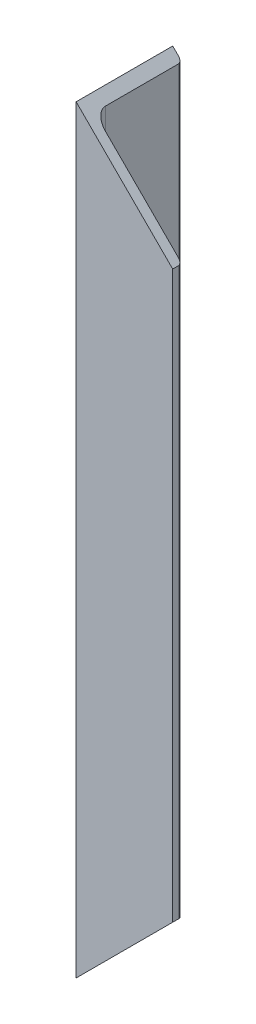
ISO-10303-21;
HEADER;
FILE_DESCRIPTION(('STEP AP214'),'2;1');
FILE_NAME('part.step','',(''),(''),'','','');
FILE_SCHEMA(('AUTOMOTIVE_DESIGN { 1 0 10303 214 1 1 1 1 }'));
ENDSEC;
DATA;
#1=APPLICATION_CONTEXT('core data for automotive mechanical design processes');
#2=APPLICATION_PROTOCOL_DEFINITION('international standard','automotive_design',2000,#1);
#3=PRODUCT_CONTEXT('',#1,'mechanical');
#4=PRODUCT('Part','Part','',(#3));
#5=PRODUCT_RELATED_PRODUCT_CATEGORY('part','',(#4));
#6=PRODUCT_DEFINITION_FORMATION('','',#4);
#7=PRODUCT_DEFINITION_CONTEXT('part definition',#1,'design');
#8=PRODUCT_DEFINITION('design','',#6,#7);
#9=PRODUCT_DEFINITION_SHAPE('','',#8);
#10=(LENGTH_UNIT() NAMED_UNIT(*) SI_UNIT(.MILLI.,.METRE.));
#11=(NAMED_UNIT(*) PLANE_ANGLE_UNIT() SI_UNIT($,.RADIAN.));
#12=(NAMED_UNIT(*) SI_UNIT($,.STERADIAN.) SOLID_ANGLE_UNIT());
#13=UNCERTAINTY_MEASURE_WITH_UNIT(LENGTH_MEASURE(1.E-05),#10,'distance_accuracy_value','');
#14=(GEOMETRIC_REPRESENTATION_CONTEXT(3) GLOBAL_UNCERTAINTY_ASSIGNED_CONTEXT((#13)) GLOBAL_UNIT_ASSIGNED_CONTEXT((#10,
#11,#12)) REPRESENTATION_CONTEXT('',''));
#15=CARTESIAN_POINT('',(0.,0.,0.));
#16=DIRECTION('',(0.,0.,1.));
#17=DIRECTION('',(1.,0.,0.));
#18=AXIS2_PLACEMENT_3D('',#15,#16,#17);
#19=CARTESIAN_POINT('',(-664.237613309007,1082.237613309,482.237613309005));
#20=DIRECTION('',(0.707106781186548,0.707106781186547,0.));
#21=DIRECTION('',(-0.707106781186547,0.707106781186548,0.));
#22=AXIS2_PLACEMENT_3D('',#19,#20,#21);
#23=PLANE('',#22);
#24=DIRECTION('',(0.707106781186547,-0.707106781186548,0.));
#25=VECTOR('',#24,1.);
#26=CARTESIAN_POINT('',(-403.000000000003,821.,500.000000000003));
#27=LINE('',#26,#25);
#28=CARTESIAN_POINT('',(-682.000000000003,1100.,500.));
#29=VERTEX_POINT('',#28);
#30=CARTESIAN_POINT('',(-619.000000000003,1037.,500.000000000001));
#31=VERTEX_POINT('',#30);
#32=EDGE_CURVE('E126',#29,#31,#27,.T.);
#33=ORIENTED_EDGE('',*,*,#32,.T.);
#34=DIRECTION('',(0.,0.,-1.));
#35=VECTOR('',#34,1.);
#36=CARTESIAN_POINT('',(-619.000000000003,1037.,499.999999999988));
#37=LINE('',#36,#35);
#38=CARTESIAN_POINT('',(-619.000000000003,1037.,496.300000000001));
#39=VERTEX_POINT('',#38);
#40=EDGE_CURVE('E109',#31,#39,#37,.T.);
#41=ORIENTED_EDGE('',*,*,#40,.T.);
#42=CARTESIAN_POINT('',(-621.300000000003,1039.3,496.300000000001));
#43=DIRECTION('',(0.707106781186548,0.707106781186547,0.));
#44=DIRECTION('',(-0.707106781186547,0.707106781186548,0.));
#45=AXIS2_PLACEMENT_3D('',#42,#43,#44);
#46=ELLIPSE('',#45,3.25269119345812,2.3);
#47=CARTESIAN_POINT('',(-621.300000000003,1039.3,494.000000000001));
#48=VERTEX_POINT('',#47);
#49=EDGE_CURVE('E115',#39,#48,#46,.T.);
#50=ORIENTED_EDGE('',*,*,#49,.T.);
#51=DIRECTION('',(-0.707106781186547,0.707106781186548,0.));
#52=VECTOR('',#51,1.);
#53=CARTESIAN_POINT('',(-404.150000000003,822.15,494.000000000003));
#54=LINE('',#53,#52);
#55=CARTESIAN_POINT('',(-669.000000000003,1087.,494.));
#56=VERTEX_POINT('',#55);
#57=EDGE_CURVE('E122',#48,#56,#54,.T.);
#58=ORIENTED_EDGE('',*,*,#57,.T.);
#59=CARTESIAN_POINT('',(-669.000000000003,1087.,487.));
#60=DIRECTION('',(0.707106781186548,0.707106781186547,0.));
#61=DIRECTION('',(-0.707106781186547,0.707106781186548,0.));
#62=AXIS2_PLACEMENT_3D('',#59,#60,#61);
#63=ELLIPSE('',#62,9.89949493661168,7.00000000000001);
#64=CARTESIAN_POINT('',(-676.000000000003,1094.,487.));
#65=VERTEX_POINT('',#64);
#66=EDGE_CURVE('E142',#56,#65,#63,.F.);
#67=ORIENTED_EDGE('',*,*,#66,.T.);
#68=DIRECTION('',(0.,0.,-1.));
#69=VECTOR('',#68,1.);
#70=CARTESIAN_POINT('',(-676.000000000003,1094.,486.999999999994));
#71=LINE('',#70,#69);
#72=CARTESIAN_POINT('',(-676.000000000003,1094.,439.3));
#73=VERTEX_POINT('',#72);
#74=EDGE_CURVE('E139',#65,#73,#71,.T.);
#75=ORIENTED_EDGE('',*,*,#74,.T.);
#76=CARTESIAN_POINT('',(-678.300000000003,1096.3,439.3));
#77=DIRECTION('',(0.707106781186548,0.707106781186547,0.));
#78=DIRECTION('',(-0.707106781186547,0.707106781186548,0.));
#79=AXIS2_PLACEMENT_3D('',#76,#77,#78);
#80=ELLIPSE('',#79,3.25269119345816,2.30000000000002);
#81=CARTESIAN_POINT('',(-678.300000000003,1096.3,437.));
#82=VERTEX_POINT('',#81);
#83=EDGE_CURVE('E136',#73,#82,#80,.T.);
#84=ORIENTED_EDGE('',*,*,#83,.T.);
#85=DIRECTION('',(-0.707106781186547,0.707106781186548,0.));
#86=VECTOR('',#85,1.);
#87=CARTESIAN_POINT('',(-432.650000000003,850.649999999999,437.000000000004));
#88=LINE('',#87,#86);
#89=CARTESIAN_POINT('',(-682.000000000003,1100.,437.));
#90=VERTEX_POINT('',#89);
#91=EDGE_CURVE('E133',#82,#90,#88,.T.);
#92=ORIENTED_EDGE('',*,*,#91,.T.);
#93=DIRECTION('',(0.,0.,1.));
#94=VECTOR('',#93,1.);
#95=CARTESIAN_POINT('',(-682.000000000003,1100.,499.999999999995));
#96=LINE('',#95,#94);
#97=EDGE_CURVE('E131',#90,#29,#96,.T.);
#98=ORIENTED_EDGE('',*,*,#97,.T.);
#99=EDGE_LOOP('',(#33,#41,#50,#58,#67,#75,#84,#92,#98));
#100=FACE_BOUND('',#99,.T.);
#101=ADVANCED_FACE('F34',(#100),#23,.T.);
#102=CARTESIAN_POINT('',(-621.300000000003,605.,496.300000000001));
#103=DIRECTION('',(0.,1.,0.));
#104=DIRECTION('',(-1.,0.,0.));
#105=AXIS2_PLACEMENT_3D('',#102,#103,#104);
#106=CYLINDRICAL_SURFACE('',#105,2.3);
#107=DIRECTION('',(0.,1.,0.));
#108=VECTOR('',#107,1.);
#109=CARTESIAN_POINT('',(-619.000000000003,605.,496.300000000001));
#110=LINE('',#109,#108);
#111=CARTESIAN_POINT('',(-619.000000000003,668.,496.300000000001));
#112=VERTEX_POINT('',#111);
#113=EDGE_CURVE('E104',#112,#39,#110,.T.);
#114=ORIENTED_EDGE('',*,*,#113,.F.);
#115=CARTESIAN_POINT('',(-621.300000000003,665.7,496.300000000001));
#116=DIRECTION('',(-0.707106781186548,0.707106781186547,0.));
#117=DIRECTION('',(0.707106781186547,0.707106781186548,0.));
#118=AXIS2_PLACEMENT_3D('',#115,#116,#117);
#119=ELLIPSE('',#118,3.25269119345811,2.3);
#120=CARTESIAN_POINT('',(-621.300000000003,665.7,494.000000000001));
#121=VERTEX_POINT('',#120);
#122=EDGE_CURVE('E37',#112,#121,#119,.T.);
#123=ORIENTED_EDGE('',*,*,#122,.T.);
#124=DIRECTION('',(0.,1.,0.));
#125=VECTOR('',#124,1.);
#126=CARTESIAN_POINT('',(-621.300000000003,605.,494.000000000001));
#127=LINE('',#126,#125);
#128=EDGE_CURVE('E118',#121,#48,#127,.T.);
#129=ORIENTED_EDGE('',*,*,#128,.T.);
#130=ORIENTED_EDGE('',*,*,#49,.F.);
#131=EDGE_LOOP('',(#114,#123,#129,#130));
#132=FACE_BOUND('',#131,.T.);
#133=ADVANCED_FACE('F116',(#132),#106,.T.);
#134=CARTESIAN_POINT('',(-621.300000000003,605.,494.000000000001));
#135=DIRECTION('',(0.,0.,1.));
#136=DIRECTION('',(1.,0.,0.));
#137=AXIS2_PLACEMENT_3D('',#134,#135,#136);
#138=PLANE('',#137);
#139=ORIENTED_EDGE('',*,*,#128,.F.);
#140=DIRECTION('',(-0.707106781186547,-0.707106781186548,0.));
#141=VECTOR('',#140,1.);
#142=CARTESIAN_POINT('',(-651.650000000003,635.35,494.));
#143=LINE('',#142,#141);
#144=CARTESIAN_POINT('',(-669.000000000004,617.999999999999,494.));
#145=VERTEX_POINT('',#144);
#146=EDGE_CURVE('E175',#121,#145,#143,.T.);
#147=ORIENTED_EDGE('',*,*,#146,.T.);
#148=DIRECTION('',(0.,1.,0.));
#149=VECTOR('',#148,1.);
#150=CARTESIAN_POINT('',(-669.000000000003,605.,494.));
#151=LINE('',#150,#149);
#152=EDGE_CURVE('E147',#145,#56,#151,.T.);
#153=ORIENTED_EDGE('',*,*,#152,.T.);
#154=ORIENTED_EDGE('',*,*,#57,.F.);
#155=EDGE_LOOP('',(#139,#147,#153,#154));
#156=FACE_BOUND('',#155,.T.);
#157=ADVANCED_FACE('F180',(#156),#138,.F.);
#158=CARTESIAN_POINT('',(-669.000000000003,605.,487.));
#159=DIRECTION('',(0.,1.,0.));
#160=DIRECTION('',(-1.,0.,0.));
#161=AXIS2_PLACEMENT_3D('',#158,#159,#160);
#162=CYLINDRICAL_SURFACE('',#161,7.00000000000001);
#163=ORIENTED_EDGE('',*,*,#152,.F.);
#164=CARTESIAN_POINT('',(-669.000000000003,618.,487.));
#165=DIRECTION('',(-0.707106781186548,0.707106781186547,0.));
#166=DIRECTION('',(0.707106781186547,0.707106781186548,0.));
#167=AXIS2_PLACEMENT_3D('',#164,#165,#166);
#168=ELLIPSE('',#167,9.89949493661167,7.00000000000001);
#169=CARTESIAN_POINT('',(-676.000000000003,611.,487.));
#170=VERTEX_POINT('',#169);
#171=EDGE_CURVE('E172',#145,#170,#168,.F.);
#172=ORIENTED_EDGE('',*,*,#171,.T.);
#173=DIRECTION('',(0.,1.,0.));
#174=VECTOR('',#173,1.);
#175=CARTESIAN_POINT('',(-676.000000000003,605.,487.));
#176=LINE('',#175,#174);
#177=EDGE_CURVE('E149',#170,#65,#176,.T.);
#178=ORIENTED_EDGE('',*,*,#177,.T.);
#179=ORIENTED_EDGE('',*,*,#66,.F.);
#180=EDGE_LOOP('',(#163,#172,#178,#179));
#181=FACE_BOUND('',#180,.T.);
#182=ADVANCED_FACE('F184',(#181),#162,.F.);
#183=CARTESIAN_POINT('',(-676.000000000003,605.,487.));
#184=DIRECTION('',(-1.,0.,0.));
#185=DIRECTION('',(0.,0.,1.));
#186=AXIS2_PLACEMENT_3D('',#183,#184,#185);
#187=PLANE('',#186);
#188=ORIENTED_EDGE('',*,*,#177,.F.);
#189=DIRECTION('',(0.,0.,-1.));
#190=VECTOR('',#189,1.);
#191=CARTESIAN_POINT('',(-676.000000000003,611.,487.));
#192=LINE('',#191,#190);
#193=CARTESIAN_POINT('',(-676.000000000003,611.000000000001,439.3));
#194=VERTEX_POINT('',#193);
#195=EDGE_CURVE('E169',#170,#194,#192,.T.);
#196=ORIENTED_EDGE('',*,*,#195,.T.);
#197=DIRECTION('',(0.,1.,0.));
#198=VECTOR('',#197,1.);
#199=CARTESIAN_POINT('',(-676.000000000003,605.,439.3));
#200=LINE('',#199,#198);
#201=EDGE_CURVE('E151',#194,#73,#200,.T.);
#202=ORIENTED_EDGE('',*,*,#201,.T.);
#203=ORIENTED_EDGE('',*,*,#74,.F.);
#204=EDGE_LOOP('',(#188,#196,#202,#203));
#205=FACE_BOUND('',#204,.T.);
#206=ADVANCED_FACE('F187',(#205),#187,.F.);
#207=CARTESIAN_POINT('',(-678.300000000003,605.,439.3));
#208=DIRECTION('',(0.,1.,0.));
#209=DIRECTION('',(-1.,0.,0.));
#210=AXIS2_PLACEMENT_3D('',#207,#208,#209);
#211=CYLINDRICAL_SURFACE('',#210,2.30000000000002);
#212=ORIENTED_EDGE('',*,*,#201,.F.);
#213=CARTESIAN_POINT('',(-678.300000000003,608.700000000001,439.3));
#214=DIRECTION('',(-0.707106781186548,0.707106781186547,0.));
#215=DIRECTION('',(0.707106781186547,0.707106781186548,0.));
#216=AXIS2_PLACEMENT_3D('',#213,#214,#215);
#217=ELLIPSE('',#216,3.25269119345815,2.30000000000002);
#218=CARTESIAN_POINT('',(-678.300000000002,608.700000000001,437.));
#219=VERTEX_POINT('',#218);
#220=EDGE_CURVE('E166',#194,#219,#217,.T.);
#221=ORIENTED_EDGE('',*,*,#220,.T.);
#222=DIRECTION('',(0.,1.,0.));
#223=VECTOR('',#222,1.);
#224=CARTESIAN_POINT('',(-678.300000000002,605.,437.));
#225=LINE('',#224,#223);
#226=EDGE_CURVE('E153',#219,#82,#225,.T.);
#227=ORIENTED_EDGE('',*,*,#226,.T.);
#228=ORIENTED_EDGE('',*,*,#83,.F.);
#229=EDGE_LOOP('',(#212,#221,#227,#228));
#230=FACE_BOUND('',#229,.T.);
#231=ADVANCED_FACE('F191',(#230),#211,.T.);
#232=CARTESIAN_POINT('',(-678.300000000002,605.,437.));
#233=DIRECTION('',(0.,0.,1.));
#234=DIRECTION('',(1.,0.,0.));
#235=AXIS2_PLACEMENT_3D('',#232,#233,#234);
#236=PLANE('',#235);
#237=ORIENTED_EDGE('',*,*,#226,.F.);
#238=DIRECTION('',(-0.707106781186547,-0.707106781186548,0.));
#239=VECTOR('',#238,1.);
#240=CARTESIAN_POINT('',(-680.150000000003,606.85,437.));
#241=LINE('',#240,#239);
#242=CARTESIAN_POINT('',(-682.000000000003,605.,437.));
#243=VERTEX_POINT('',#242);
#244=EDGE_CURVE('E161',#219,#243,#241,.T.);
#245=ORIENTED_EDGE('',*,*,#244,.T.);
#246=DIRECTION('',(0.,1.,0.));
#247=VECTOR('',#246,1.);
#248=CARTESIAN_POINT('',(-682.000000000003,605.,437.));
#249=LINE('',#248,#247);
#250=EDGE_CURVE('E155',#243,#90,#249,.T.);
#251=ORIENTED_EDGE('',*,*,#250,.T.);
#252=ORIENTED_EDGE('',*,*,#91,.F.);
#253=EDGE_LOOP('',(#237,#245,#251,#252));
#254=FACE_BOUND('',#253,.T.);
#255=ADVANCED_FACE('F196',(#254),#236,.F.);
#256=CARTESIAN_POINT('',(-682.000000000003,605.,500.));
#257=DIRECTION('',(1.,0.,0.));
#258=DIRECTION('',(0.,0.,-1.));
#259=AXIS2_PLACEMENT_3D('',#256,#257,#258);
#260=PLANE('',#259);
#261=ORIENTED_EDGE('',*,*,#250,.F.);
#262=DIRECTION('',(0.,0.,1.));
#263=VECTOR('',#262,1.);
#264=CARTESIAN_POINT('',(-682.000000000003,605.,500.));
#265=LINE('',#264,#263);
#266=CARTESIAN_POINT('',(-682.000000000003,605.,500.));
#267=VERTEX_POINT('',#266);
#268=EDGE_CURVE('E54',#243,#267,#265,.T.);
#269=ORIENTED_EDGE('',*,*,#268,.T.);
#270=DIRECTION('',(0.,1.,0.));
#271=VECTOR('',#270,1.);
#272=CARTESIAN_POINT('',(-682.000000000003,605.,500.));
#273=LINE('',#272,#271);
#274=EDGE_CURVE('E157',#267,#29,#273,.T.);
#275=ORIENTED_EDGE('',*,*,#274,.T.);
#276=ORIENTED_EDGE('',*,*,#97,.F.);
#277=EDGE_LOOP('',(#261,#269,#275,#276));
#278=FACE_BOUND('',#277,.T.);
#279=ADVANCED_FACE('F198',(#278),#260,.F.);
#280=CARTESIAN_POINT('',(-619.000000000003,605.,500.000000000001));
#281=DIRECTION('',(0.,0.,-1.));
#282=DIRECTION('',(-1.,0.,0.));
#283=AXIS2_PLACEMENT_3D('',#280,#281,#282);
#284=PLANE('',#283);
#285=ORIENTED_EDGE('',*,*,#274,.F.);
#286=DIRECTION('',(0.707106781186547,0.707106781186548,0.));
#287=VECTOR('',#286,1.);
#288=CARTESIAN_POINT('',(-650.500000000003,636.5,500.));
#289=LINE('',#288,#287);
#290=CARTESIAN_POINT('',(-619.000000000003,668.,500.000000000001));
#291=VERTEX_POINT('',#290);
#292=EDGE_CURVE('E42',#267,#291,#289,.T.);
#293=ORIENTED_EDGE('',*,*,#292,.T.);
#294=DIRECTION('',(0.,1.,0.));
#295=VECTOR('',#294,1.);
#296=CARTESIAN_POINT('',(-619.000000000003,605.,500.000000000001));
#297=LINE('',#296,#295);
#298=EDGE_CURVE('E113',#291,#31,#297,.T.);
#299=ORIENTED_EDGE('',*,*,#298,.T.);
#300=ORIENTED_EDGE('',*,*,#32,.F.);
#301=EDGE_LOOP('',(#285,#293,#299,#300));
#302=FACE_BOUND('',#301,.T.);
#303=ADVANCED_FACE('F160',(#302),#284,.F.);
#304=CARTESIAN_POINT('',(-619.000000000003,605.,500.000000000001));
#305=DIRECTION('',(-1.,0.,0.));
#306=DIRECTION('',(0.,0.,1.));
#307=AXIS2_PLACEMENT_3D('',#304,#305,#306);
#308=PLANE('',#307);
#309=ORIENTED_EDGE('',*,*,#298,.F.);
#310=DIRECTION('',(0.,0.,-1.));
#311=VECTOR('',#310,1.);
#312=CARTESIAN_POINT('',(-619.000000000003,668.,500.000000000002));
#313=LINE('',#312,#311);
#314=EDGE_CURVE('E11',#291,#112,#313,.T.);
#315=ORIENTED_EDGE('',*,*,#314,.T.);
#316=ORIENTED_EDGE('',*,*,#113,.T.);
#317=ORIENTED_EDGE('',*,*,#40,.F.);
#318=EDGE_LOOP('',(#309,#315,#316,#317));
#319=FACE_BOUND('',#318,.T.);
#320=ADVANCED_FACE('F107',(#319),#308,.F.);
#321=CARTESIAN_POINT('',(-664.354376539067,622.645623460936,482.354376539065));
#322=DIRECTION('',(-0.707106781186548,0.707106781186547,0.));
#323=DIRECTION('',(-0.707106781186547,-0.707106781186548,0.));
#324=AXIS2_PLACEMENT_3D('',#321,#322,#323);
#325=PLANE('',#324);
#326=ORIENTED_EDGE('',*,*,#292,.F.);
#327=ORIENTED_EDGE('',*,*,#268,.F.);
#328=ORIENTED_EDGE('',*,*,#244,.F.);
#329=ORIENTED_EDGE('',*,*,#220,.F.);
#330=ORIENTED_EDGE('',*,*,#195,.F.);
#331=ORIENTED_EDGE('',*,*,#171,.F.);
#332=ORIENTED_EDGE('',*,*,#146,.F.);
#333=ORIENTED_EDGE('',*,*,#122,.F.);
#334=ORIENTED_EDGE('',*,*,#314,.F.);
#335=EDGE_LOOP('',(#326,#327,#328,#329,#330,#331,#332,#333,#334));
#336=FACE_BOUND('',#335,.T.);
#337=ADVANCED_FACE('F178',(#336),#325,.F.);
#338=CLOSED_SHELL('',(#101,#133,#157,#182,#206,#231,#255,#279,#303,#320,#337));
#339=MANIFOLD_SOLID_BREP('B2',#338);
#340=ADVANCED_BREP_SHAPE_REPRESENTATION('',(#18,#339),#14);
#341=SHAPE_DEFINITION_REPRESENTATION(#9,#340);
ENDSEC;
END-ISO-10303-21;
